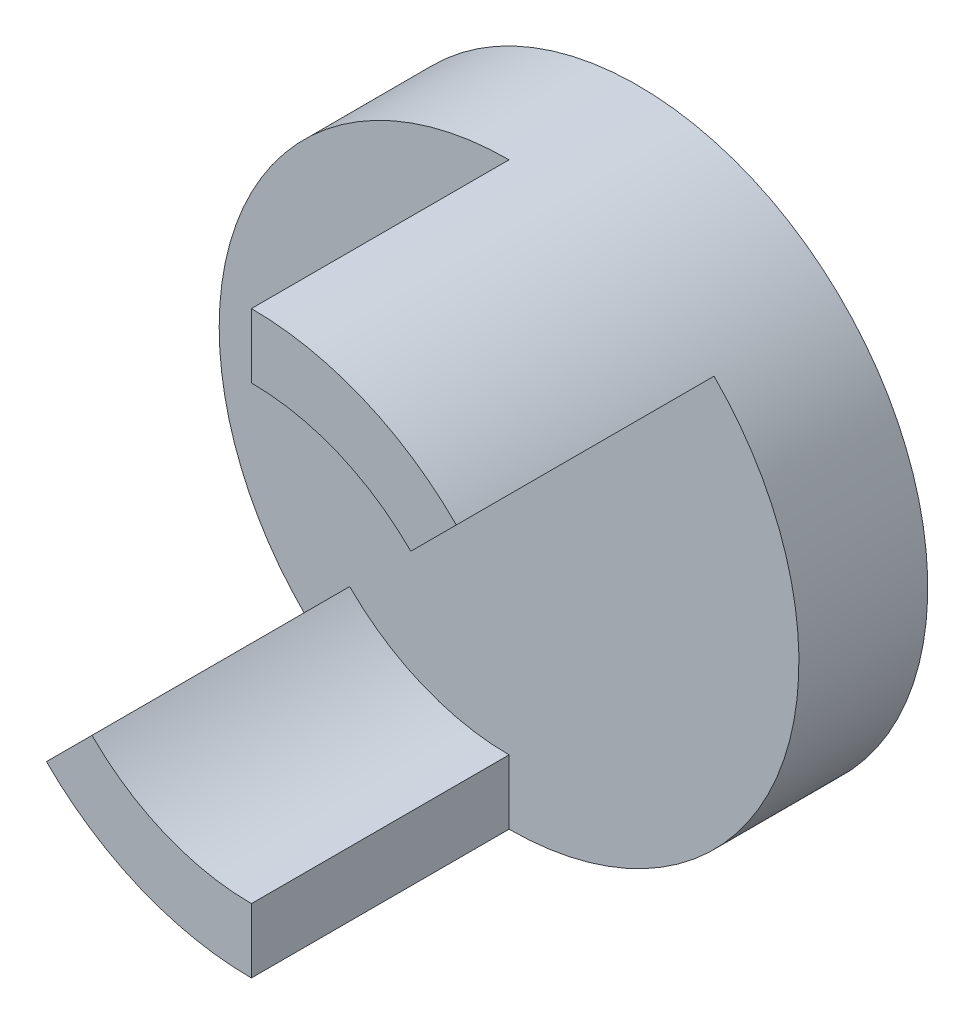
ISO-10303-21;
HEADER;
FILE_DESCRIPTION(('STEP AP214'),'2;1');
FILE_NAME('part.step','',(''),(''),'','','');
FILE_SCHEMA(('AUTOMOTIVE_DESIGN { 1 0 10303 214 1 1 1 1 }'));
ENDSEC;
DATA;
#1=APPLICATION_CONTEXT('core data for automotive mechanical design processes');
#2=APPLICATION_PROTOCOL_DEFINITION('international standard','automotive_design',2000,#1);
#3=PRODUCT_CONTEXT('',#1,'mechanical');
#4=PRODUCT('Part','Part','',(#3));
#5=PRODUCT_RELATED_PRODUCT_CATEGORY('part','',(#4));
#6=PRODUCT_DEFINITION_FORMATION('','',#4);
#7=PRODUCT_DEFINITION_CONTEXT('part definition',#1,'design');
#8=PRODUCT_DEFINITION('design','',#6,#7);
#9=PRODUCT_DEFINITION_SHAPE('','',#8);
#10=(LENGTH_UNIT() NAMED_UNIT(*) SI_UNIT(.MILLI.,.METRE.));
#11=(NAMED_UNIT(*) PLANE_ANGLE_UNIT() SI_UNIT($,.RADIAN.));
#12=(NAMED_UNIT(*) SI_UNIT($,.STERADIAN.) SOLID_ANGLE_UNIT());
#13=UNCERTAINTY_MEASURE_WITH_UNIT(LENGTH_MEASURE(1.E-05),#10,'distance_accuracy_value','');
#14=(GEOMETRIC_REPRESENTATION_CONTEXT(3) GLOBAL_UNCERTAINTY_ASSIGNED_CONTEXT((#13)) GLOBAL_UNIT_ASSIGNED_CONTEXT((#10,
#11,#12)) REPRESENTATION_CONTEXT('',''));
#15=CARTESIAN_POINT('',(0.,0.,0.));
#16=DIRECTION('',(0.,0.,1.));
#17=DIRECTION('',(1.,0.,0.));
#18=AXIS2_PLACEMENT_3D('',#15,#16,#17);
#19=CARTESIAN_POINT('',(0.,0.,2.));
#20=DIRECTION('',(0.,0.,-1.));
#21=DIRECTION('',(-1.,0.,0.));
#22=AXIS2_PLACEMENT_3D('',#19,#20,#21);
#23=CYLINDRICAL_SURFACE('',#22,2.25);
#24=CARTESIAN_POINT('',(0.,0.,-1.));
#25=DIRECTION('',(0.,0.,-1.));
#26=DIRECTION('',(-1.,0.,0.));
#27=AXIS2_PLACEMENT_3D('',#24,#25,#26);
#28=CIRCLE('',#27,2.25);
#29=CARTESIAN_POINT('',(-2.25,0.,-1.));
#30=VERTEX_POINT('',#29);
#31=EDGE_CURVE('E152',#30,#30,#28,.T.);
#32=ORIENTED_EDGE('',*,*,#31,.F.);
#33=EDGE_LOOP('',(#32));
#34=FACE_BOUND('',#33,.T.);
#35=DIRECTION('',(0.,0.,1.));
#36=VECTOR('',#35,1.);
#37=CARTESIAN_POINT('',(-1.59099025766973,-1.59099025766973,1.));
#38=LINE('',#37,#36);
#39=CARTESIAN_POINT('',(-1.59099025766973,-1.59099025766973,0.));
#40=VERTEX_POINT('',#39);
#41=CARTESIAN_POINT('',(-1.59099025766973,-1.59099025766973,2.));
#42=VERTEX_POINT('',#41);
#43=EDGE_CURVE('E172',#40,#42,#38,.T.);
#44=ORIENTED_EDGE('',*,*,#43,.F.);
#45=CARTESIAN_POINT('',(0.,0.,0.));
#46=DIRECTION('',(0.,0.,1.));
#47=DIRECTION('',(1.,0.,0.));
#48=AXIS2_PLACEMENT_3D('',#45,#46,#47);
#49=CIRCLE('',#48,2.25);
#50=CARTESIAN_POINT('',(0.,2.25,0.));
#51=VERTEX_POINT('',#50);
#52=EDGE_CURVE('E179',#51,#40,#49,.T.);
#53=ORIENTED_EDGE('',*,*,#52,.F.);
#54=DIRECTION('',(0.,0.,1.));
#55=VECTOR('',#54,1.);
#56=CARTESIAN_POINT('',(0.,2.25,1.));
#57=LINE('',#56,#55);
#58=CARTESIAN_POINT('',(0.,2.25,2.));
#59=VERTEX_POINT('',#58);
#60=EDGE_CURVE('E171',#51,#59,#57,.T.);
#61=ORIENTED_EDGE('',*,*,#60,.T.);
#62=CARTESIAN_POINT('',(0.,0.,2.));
#63=DIRECTION('',(0.,0.,1.));
#64=DIRECTION('',(1.,0.,0.));
#65=AXIS2_PLACEMENT_3D('',#62,#63,#64);
#66=CIRCLE('',#65,2.25);
#67=CARTESIAN_POINT('',(1.59099025766973,1.59099025766973,2.));
#68=VERTEX_POINT('',#67);
#69=EDGE_CURVE('E12',#68,#59,#66,.T.);
#70=ORIENTED_EDGE('',*,*,#69,.F.);
#71=DIRECTION('',(0.,0.,1.));
#72=VECTOR('',#71,1.);
#73=CARTESIAN_POINT('',(1.59099025766973,1.59099025766973,1.));
#74=LINE('',#73,#72);
#75=CARTESIAN_POINT('',(1.59099025766973,1.59099025766973,0.));
#76=VERTEX_POINT('',#75);
#77=EDGE_CURVE('E164',#76,#68,#74,.T.);
#78=ORIENTED_EDGE('',*,*,#77,.F.);
#79=CARTESIAN_POINT('',(0.,0.,0.));
#80=DIRECTION('',(0.,0.,1.));
#81=DIRECTION('',(1.,0.,0.));
#82=AXIS2_PLACEMENT_3D('',#79,#80,#81);
#83=CIRCLE('',#82,2.25);
#84=CARTESIAN_POINT('',(0.,-2.25,0.));
#85=VERTEX_POINT('',#84);
#86=EDGE_CURVE('E151',#85,#76,#83,.T.);
#87=ORIENTED_EDGE('',*,*,#86,.F.);
#88=DIRECTION('',(0.,0.,1.));
#89=VECTOR('',#88,1.);
#90=CARTESIAN_POINT('',(0.,-2.25,1.));
#91=LINE('',#90,#89);
#92=CARTESIAN_POINT('',(0.,-2.25,2.));
#93=VERTEX_POINT('',#92);
#94=EDGE_CURVE('E163',#85,#93,#91,.T.);
#95=ORIENTED_EDGE('',*,*,#94,.T.);
#96=EDGE_CURVE('E70',#42,#93,#66,.T.);
#97=ORIENTED_EDGE('',*,*,#96,.F.);
#98=EDGE_LOOP('',(#44,#53,#61,#70,#78,#87,#95,#97));
#99=FACE_BOUND('',#98,.T.);
#100=ADVANCED_FACE('F63',(#34,#99),#23,.T.);
#101=CARTESIAN_POINT('',(0.,0.,2.));
#102=DIRECTION('',(0.,0.,1.));
#103=DIRECTION('',(1.,0.,0.));
#104=AXIS2_PLACEMENT_3D('',#101,#102,#103);
#105=PLANE('',#104);
#106=CARTESIAN_POINT('',(0.,0.,2.));
#107=DIRECTION('',(0.,0.,1.));
#108=DIRECTION('',(1.,0.,0.));
#109=AXIS2_PLACEMENT_3D('',#106,#107,#108);
#110=CIRCLE('',#109,1.75);
#111=CARTESIAN_POINT('',(1.23743686707646,1.23743686707646,2.));
#112=VERTEX_POINT('',#111);
#113=CARTESIAN_POINT('',(0.,1.75,2.));
#114=VERTEX_POINT('',#113);
#115=EDGE_CURVE('E184',#112,#114,#110,.T.);
#116=ORIENTED_EDGE('',*,*,#115,.F.);
#117=DIRECTION('',(0.707106781186549,0.707106781186546,0.));
#118=VECTOR('',#117,1.);
#119=CARTESIAN_POINT('',(0.,0.,2.));
#120=LINE('',#119,#118);
#121=EDGE_CURVE('E146',#112,#68,#120,.T.);
#122=ORIENTED_EDGE('',*,*,#121,.T.);
#123=ORIENTED_EDGE('',*,*,#69,.T.);
#124=DIRECTION('',(0.,1.,0.));
#125=VECTOR('',#124,1.);
#126=CARTESIAN_POINT('',(0.,0.,2.));
#127=LINE('',#126,#125);
#128=EDGE_CURVE('E169',#114,#59,#127,.T.);
#129=ORIENTED_EDGE('',*,*,#128,.F.);
#130=EDGE_LOOP('',(#116,#122,#123,#129));
#131=FACE_BOUND('',#130,.T.);
#132=ADVANCED_FACE('F183',(#131),#105,.T.);
#133=CARTESIAN_POINT('',(-1.23743686707646,-1.23743686707646,2.));
#134=VERTEX_POINT('',#133);
#135=CARTESIAN_POINT('',(0.,-1.75,2.));
#136=VERTEX_POINT('',#135);
#137=EDGE_CURVE('E191',#134,#136,#110,.T.);
#138=ORIENTED_EDGE('',*,*,#137,.F.);
#139=DIRECTION('',(-0.707106781186549,-0.707106781186546,0.));
#140=VECTOR('',#139,1.);
#141=CARTESIAN_POINT('',(0.,0.,2.));
#142=LINE('',#141,#140);
#143=EDGE_CURVE('E85',#134,#42,#142,.T.);
#144=ORIENTED_EDGE('',*,*,#143,.T.);
#145=ORIENTED_EDGE('',*,*,#96,.T.);
#146=DIRECTION('',(0.,-1.,0.));
#147=VECTOR('',#146,1.);
#148=CARTESIAN_POINT('',(0.,0.,2.));
#149=LINE('',#148,#147);
#150=EDGE_CURVE('E155',#136,#93,#149,.T.);
#151=ORIENTED_EDGE('',*,*,#150,.F.);
#152=EDGE_LOOP('',(#138,#144,#145,#151));
#153=FACE_BOUND('',#152,.T.);
#154=ADVANCED_FACE('F190',(#153),#105,.T.);
#155=CARTESIAN_POINT('',(0.,0.,1.));
#156=DIRECTION('',(-0.707106781186546,0.707106781186549,0.));
#157=DIRECTION('',(-0.707106781186549,-0.707106781186546,0.));
#158=AXIS2_PLACEMENT_3D('',#155,#156,#157);
#159=PLANE('',#158);
#160=DIRECTION('',(0.,0.,1.));
#161=VECTOR('',#160,1.);
#162=CARTESIAN_POINT('',(-1.23743686707646,-1.23743686707646,0.));
#163=LINE('',#162,#161);
#164=CARTESIAN_POINT('',(-1.23743686707646,-1.23743686707646,0.));
#165=VERTEX_POINT('',#164);
#166=EDGE_CURVE('E199',#165,#134,#163,.T.);
#167=ORIENTED_EDGE('',*,*,#166,.F.);
#168=DIRECTION('',(-0.707106781186549,-0.707106781186546,0.));
#169=VECTOR('',#168,1.);
#170=CARTESIAN_POINT('',(0.,0.,0.));
#171=LINE('',#170,#169);
#172=EDGE_CURVE('E204',#165,#40,#171,.T.);
#173=ORIENTED_EDGE('',*,*,#172,.T.);
#174=ORIENTED_EDGE('',*,*,#43,.T.);
#175=ORIENTED_EDGE('',*,*,#143,.F.);
#176=EDGE_LOOP('',(#167,#173,#174,#175));
#177=FACE_BOUND('',#176,.T.);
#178=ADVANCED_FACE('F207',(#177),#159,.T.);
#179=CARTESIAN_POINT('',(0.,0.,1.));
#180=DIRECTION('',(1.,0.,0.));
#181=DIRECTION('',(0.,0.,-1.));
#182=AXIS2_PLACEMENT_3D('',#179,#180,#181);
#183=PLANE('',#182);
#184=DIRECTION('',(0.,-1.,0.));
#185=VECTOR('',#184,1.);
#186=CARTESIAN_POINT('',(0.,0.,0.));
#187=LINE('',#186,#185);
#188=CARTESIAN_POINT('',(0.,1.75,0.));
#189=VERTEX_POINT('',#188);
#190=EDGE_CURVE('E201',#51,#189,#187,.T.);
#191=ORIENTED_EDGE('',*,*,#190,.T.);
#192=DIRECTION('',(0.,0.,1.));
#193=VECTOR('',#192,1.);
#194=CARTESIAN_POINT('',(0.,1.75,0.));
#195=LINE('',#194,#193);
#196=EDGE_CURVE('E134',#189,#114,#195,.T.);
#197=ORIENTED_EDGE('',*,*,#196,.T.);
#198=ORIENTED_EDGE('',*,*,#128,.T.);
#199=ORIENTED_EDGE('',*,*,#60,.F.);
#200=EDGE_LOOP('',(#191,#197,#198,#199));
#201=FACE_BOUND('',#200,.T.);
#202=ADVANCED_FACE('F208',(#201),#183,.F.);
#203=CARTESIAN_POINT('',(0.,0.,1.));
#204=DIRECTION('',(0.707106781186546,-0.707106781186549,0.));
#205=DIRECTION('',(0.707106781186549,0.707106781186546,0.));
#206=AXIS2_PLACEMENT_3D('',#203,#204,#205);
#207=PLANE('',#206);
#208=DIRECTION('',(0.,0.,1.));
#209=VECTOR('',#208,1.);
#210=CARTESIAN_POINT('',(1.23743686707646,1.23743686707646,0.));
#211=LINE('',#210,#209);
#212=CARTESIAN_POINT('',(1.23743686707646,1.23743686707646,0.));
#213=VERTEX_POINT('',#212);
#214=EDGE_CURVE('E131',#213,#112,#211,.T.);
#215=ORIENTED_EDGE('',*,*,#214,.F.);
#216=DIRECTION('',(0.707106781186549,0.707106781186546,0.));
#217=VECTOR('',#216,1.);
#218=CARTESIAN_POINT('',(0.,0.,0.));
#219=LINE('',#218,#217);
#220=EDGE_CURVE('E144',#213,#76,#219,.T.);
#221=ORIENTED_EDGE('',*,*,#220,.T.);
#222=ORIENTED_EDGE('',*,*,#77,.T.);
#223=ORIENTED_EDGE('',*,*,#121,.F.);
#224=EDGE_LOOP('',(#215,#221,#222,#223));
#225=FACE_BOUND('',#224,.T.);
#226=ADVANCED_FACE('F142',(#225),#207,.T.);
#227=CARTESIAN_POINT('',(0.,0.,1.));
#228=DIRECTION('',(-1.,0.,0.));
#229=DIRECTION('',(0.,0.,1.));
#230=AXIS2_PLACEMENT_3D('',#227,#228,#229);
#231=PLANE('',#230);
#232=DIRECTION('',(0.,-1.,0.));
#233=VECTOR('',#232,1.);
#234=CARTESIAN_POINT('',(0.,0.,0.));
#235=LINE('',#234,#233);
#236=CARTESIAN_POINT('',(0.,-1.75,0.));
#237=VERTEX_POINT('',#236);
#238=EDGE_CURVE('E157',#237,#85,#235,.T.);
#239=ORIENTED_EDGE('',*,*,#238,.F.);
#240=DIRECTION('',(0.,0.,1.));
#241=VECTOR('',#240,1.);
#242=CARTESIAN_POINT('',(0.,-1.75,0.));
#243=LINE('',#242,#241);
#244=EDGE_CURVE('E138',#237,#136,#243,.T.);
#245=ORIENTED_EDGE('',*,*,#244,.T.);
#246=ORIENTED_EDGE('',*,*,#150,.T.);
#247=ORIENTED_EDGE('',*,*,#94,.F.);
#248=EDGE_LOOP('',(#239,#245,#246,#247));
#249=FACE_BOUND('',#248,.T.);
#250=ADVANCED_FACE('F193',(#249),#231,.F.);
#251=CARTESIAN_POINT('',(0.,0.,-1.));
#252=DIRECTION('',(0.,0.,-1.));
#253=DIRECTION('',(-1.,0.,0.));
#254=AXIS2_PLACEMENT_3D('',#251,#252,#253);
#255=PLANE('',#254);
#256=ORIENTED_EDGE('',*,*,#31,.T.);
#257=EDGE_LOOP('',(#256));
#258=FACE_BOUND('',#257,.T.);
#259=ADVANCED_FACE('F227',(#258),#255,.T.);
#260=CARTESIAN_POINT('',(0.,0.,0.));
#261=DIRECTION('',(0.,0.,1.));
#262=DIRECTION('',(1.,0.,0.));
#263=AXIS2_PLACEMENT_3D('',#260,#261,#262);
#264=PLANE('',#263);
#265=ORIENTED_EDGE('',*,*,#172,.F.);
#266=CARTESIAN_POINT('',(0.,0.,0.));
#267=DIRECTION('',(0.,0.,1.));
#268=DIRECTION('',(1.,0.,0.));
#269=AXIS2_PLACEMENT_3D('',#266,#267,#268);
#270=CIRCLE('',#269,1.75);
#271=EDGE_CURVE('E77',#165,#237,#270,.T.);
#272=ORIENTED_EDGE('',*,*,#271,.T.);
#273=ORIENTED_EDGE('',*,*,#238,.T.);
#274=ORIENTED_EDGE('',*,*,#86,.T.);
#275=ORIENTED_EDGE('',*,*,#220,.F.);
#276=EDGE_CURVE('E128',#213,#189,#270,.T.);
#277=ORIENTED_EDGE('',*,*,#276,.T.);
#278=ORIENTED_EDGE('',*,*,#190,.F.);
#279=ORIENTED_EDGE('',*,*,#52,.T.);
#280=EDGE_LOOP('',(#265,#272,#273,#274,#275,#277,#278,#279));
#281=FACE_BOUND('',#280,.T.);
#282=ADVANCED_FACE('F149',(#281),#264,.T.);
#283=CARTESIAN_POINT('',(0.,0.,0.));
#284=DIRECTION('',(0.,0.,1.));
#285=DIRECTION('',(1.,0.,0.));
#286=AXIS2_PLACEMENT_3D('',#283,#284,#285);
#287=CYLINDRICAL_SURFACE('',#286,1.75);
#288=ORIENTED_EDGE('',*,*,#166,.T.);
#289=ORIENTED_EDGE('',*,*,#137,.T.);
#290=ORIENTED_EDGE('',*,*,#244,.F.);
#291=ORIENTED_EDGE('',*,*,#271,.F.);
#292=EDGE_LOOP('',(#288,#289,#290,#291));
#293=FACE_BOUND('',#292,.T.);
#294=ADVANCED_FACE('F234',(#293),#287,.F.);
#295=ORIENTED_EDGE('',*,*,#276,.F.);
#296=ORIENTED_EDGE('',*,*,#214,.T.);
#297=ORIENTED_EDGE('',*,*,#115,.T.);
#298=ORIENTED_EDGE('',*,*,#196,.F.);
#299=EDGE_LOOP('',(#295,#296,#297,#298));
#300=FACE_BOUND('',#299,.T.);
#301=ADVANCED_FACE('F130',(#300),#287,.F.);
#302=CLOSED_SHELL('',(#100,#132,#154,#178,#202,#226,#250,#259,#282,#294,#301));
#303=MANIFOLD_SOLID_BREP('B2',#302);
#304=ADVANCED_BREP_SHAPE_REPRESENTATION('',(#18,#303),#14);
#305=SHAPE_DEFINITION_REPRESENTATION(#9,#304);
ENDSEC;
END-ISO-10303-21;
